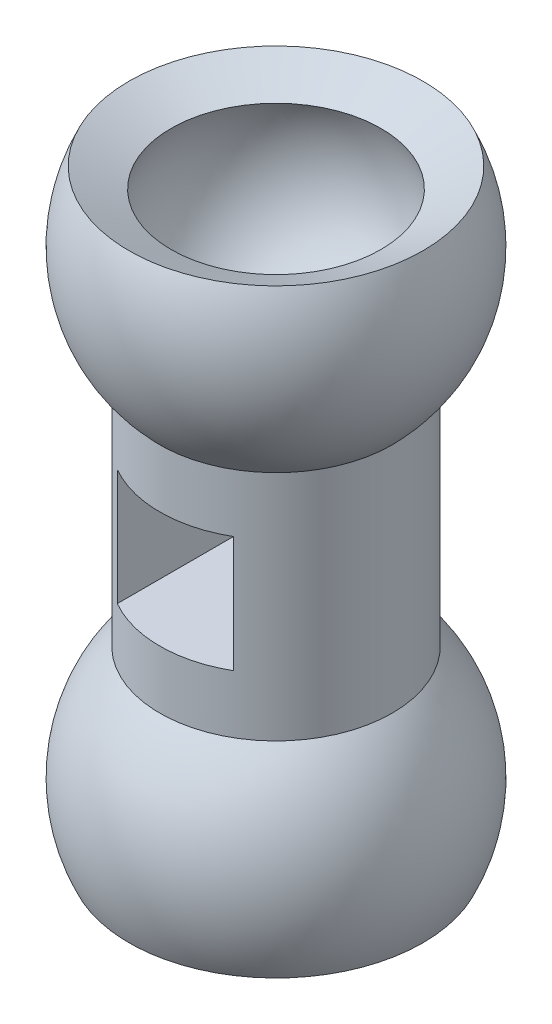
ISO-10303-21;
HEADER;
FILE_DESCRIPTION(('STEP AP214'),'2;1');
FILE_NAME('part.step','',(''),(''),'','','');
FILE_SCHEMA(('AUTOMOTIVE_DESIGN { 1 0 10303 214 1 1 1 1 }'));
ENDSEC;
DATA;
#1=APPLICATION_CONTEXT('core data for automotive mechanical design processes');
#2=APPLICATION_PROTOCOL_DEFINITION('international standard','automotive_design',2000,#1);
#3=PRODUCT_CONTEXT('',#1,'mechanical');
#4=PRODUCT('Part','Part','',(#3));
#5=PRODUCT_RELATED_PRODUCT_CATEGORY('part','',(#4));
#6=PRODUCT_DEFINITION_FORMATION('','',#4);
#7=PRODUCT_DEFINITION_CONTEXT('part definition',#1,'design');
#8=PRODUCT_DEFINITION('design','',#6,#7);
#9=PRODUCT_DEFINITION_SHAPE('','',#8);
#10=(LENGTH_UNIT() NAMED_UNIT(*) SI_UNIT(.MILLI.,.METRE.));
#11=(NAMED_UNIT(*) PLANE_ANGLE_UNIT() SI_UNIT($,.RADIAN.));
#12=(NAMED_UNIT(*) SI_UNIT($,.STERADIAN.) SOLID_ANGLE_UNIT());
#13=UNCERTAINTY_MEASURE_WITH_UNIT(LENGTH_MEASURE(1.E-05),#10,'distance_accuracy_value','');
#14=(GEOMETRIC_REPRESENTATION_CONTEXT(3) GLOBAL_UNCERTAINTY_ASSIGNED_CONTEXT((#13)) GLOBAL_UNIT_ASSIGNED_CONTEXT((#10,
#11,#12)) REPRESENTATION_CONTEXT('',''));
#15=CARTESIAN_POINT('',(0.,0.,0.));
#16=DIRECTION('',(0.,0.,1.));
#17=DIRECTION('',(1.,0.,0.));
#18=AXIS2_PLACEMENT_3D('',#15,#16,#17);
#19=CARTESIAN_POINT('',(0.,12.8629636734559,0.));
#20=DIRECTION('',(0.,1.,0.));
#21=DIRECTION('',(0.,0.,1.));
#22=AXIS2_PLACEMENT_3D('',#19,#20,#21);
#23=CYLINDRICAL_SURFACE('',#22,5.);
#24=DIRECTION('',(0.,1.,0.));
#25=VECTOR('',#24,1.);
#26=CARTESIAN_POINT('',(2.5,12.8629636734559,4.33012701892219));
#27=LINE('',#26,#25);
#28=CARTESIAN_POINT('',(2.5,-7.39897948556636,4.33012701892219));
#29=VERTEX_POINT('',#28);
#30=CARTESIAN_POINT('',(2.5,-12.3989794855664,4.33012701892219));
#31=VERTEX_POINT('',#30);
#32=EDGE_CURVE('E55',#29,#31,#27,.F.);
#33=ORIENTED_EDGE('',*,*,#32,.T.);
#34=CARTESIAN_POINT('',(0.,-12.3989794855664,0.));
#35=DIRECTION('',(0.,1.,0.));
#36=DIRECTION('',(0.,0.,1.));
#37=AXIS2_PLACEMENT_3D('',#34,#35,#36);
#38=CIRCLE('',#37,5.);
#39=CARTESIAN_POINT('',(-2.5,-12.3989794855664,4.3301270189222));
#40=VERTEX_POINT('',#39);
#41=EDGE_CURVE('E43',#40,#31,#38,.T.);
#42=ORIENTED_EDGE('',*,*,#41,.F.);
#43=DIRECTION('',(0.,1.,0.));
#44=VECTOR('',#43,1.);
#45=CARTESIAN_POINT('',(-2.5,12.8629636734559,4.3301270189222));
#46=LINE('',#45,#44);
#47=CARTESIAN_POINT('',(-2.5,-7.39897948556636,4.3301270189222));
#48=VERTEX_POINT('',#47);
#49=EDGE_CURVE('E87',#40,#48,#46,.T.);
#50=ORIENTED_EDGE('',*,*,#49,.T.);
#51=CARTESIAN_POINT('',(0.,-7.39897948556636,0.));
#52=DIRECTION('',(0.,1.,0.));
#53=DIRECTION('',(0.,0.,1.));
#54=AXIS2_PLACEMENT_3D('',#51,#52,#53);
#55=CIRCLE('',#54,5.);
#56=EDGE_CURVE('E140',#48,#29,#55,.T.);
#57=ORIENTED_EDGE('',*,*,#56,.T.);
#58=EDGE_LOOP('',(#33,#42,#50,#57));
#59=FACE_BOUND('',#58,.T.);
#60=CARTESIAN_POINT('',(0.,-4.89897948556636,0.));
#61=DIRECTION('',(0.,1.,0.));
#62=DIRECTION('',(0.,0.,1.));
#63=AXIS2_PLACEMENT_3D('',#60,#61,#62);
#64=CIRCLE('',#63,5.);
#65=CARTESIAN_POINT('',(5.,-4.89897948556636,0.));
#66=VERTEX_POINT('',#65);
#67=EDGE_CURVE('E137',#66,#66,#64,.T.);
#68=ORIENTED_EDGE('',*,*,#67,.F.);
#69=EDGE_LOOP('',(#68));
#70=FACE_BOUND('',#69,.T.);
#71=CARTESIAN_POINT('',(0.,-14.8989794855664,0.));
#72=DIRECTION('',(0.,1.,0.));
#73=DIRECTION('',(0.,0.,1.));
#74=AXIS2_PLACEMENT_3D('',#71,#72,#73);
#75=CIRCLE('',#74,5.);
#76=CARTESIAN_POINT('',(5.,-14.8989794855664,0.));
#77=VERTEX_POINT('',#76);
#78=EDGE_CURVE('E113',#77,#77,#75,.T.);
#79=ORIENTED_EDGE('',*,*,#78,.T.);
#80=EDGE_LOOP('',(#79));
#81=FACE_BOUND('',#80,.T.);
#82=CARTESIAN_POINT('',(2.5,-12.3989794855664,-4.33012701892219));
#83=VERTEX_POINT('',#82);
#84=CARTESIAN_POINT('',(-2.5,-12.3989794855664,-4.3301270189222));
#85=VERTEX_POINT('',#84);
#86=EDGE_CURVE('E11',#83,#85,#38,.T.);
#87=ORIENTED_EDGE('',*,*,#86,.F.);
#88=DIRECTION('',(0.,1.,0.));
#89=VECTOR('',#88,1.);
#90=CARTESIAN_POINT('',(2.5,12.8629636734559,-4.33012701892219));
#91=LINE('',#90,#89);
#92=CARTESIAN_POINT('',(2.5,-7.39897948556636,-4.33012701892219));
#93=VERTEX_POINT('',#92);
#94=EDGE_CURVE('E126',#83,#93,#91,.T.);
#95=ORIENTED_EDGE('',*,*,#94,.T.);
#96=CARTESIAN_POINT('',(-2.5,-7.39897948556636,-4.3301270189222));
#97=VERTEX_POINT('',#96);
#98=EDGE_CURVE('E62',#93,#97,#55,.T.);
#99=ORIENTED_EDGE('',*,*,#98,.T.);
#100=DIRECTION('',(0.,1.,0.));
#101=VECTOR('',#100,1.);
#102=CARTESIAN_POINT('',(-2.5,12.8629636734559,-4.3301270189222));
#103=LINE('',#102,#101);
#104=EDGE_CURVE('E81',#97,#85,#103,.F.);
#105=ORIENTED_EDGE('',*,*,#104,.T.);
#106=EDGE_LOOP('',(#87,#95,#99,#105));
#107=FACE_BOUND('',#106,.T.);
#108=ADVANCED_FACE('F39',(#59,#70,#81,#107),#23,.T.);
#109=CARTESIAN_POINT('',(0.,0.,0.));
#110=DIRECTION('',(0.,1.,0.));
#111=DIRECTION('',(1.,0.,0.));
#112=AXIS2_PLACEMENT_3D('',#109,#110,#111);
#113=SPHERICAL_SURFACE('',#112,7.);
#114=CARTESIAN_POINT('',(0.,3.,0.));
#115=DIRECTION('',(0.,1.,0.));
#116=DIRECTION('',(0.,0.,1.));
#117=AXIS2_PLACEMENT_3D('',#114,#115,#116);
#118=CIRCLE('',#117,6.32455532033676);
#119=CARTESIAN_POINT('',(6.32455532033676,3.,0.));
#120=VERTEX_POINT('',#119);
#121=EDGE_CURVE('E129',#120,#120,#118,.T.);
#122=CARTESIAN_POINT('',(6.32455532033676,3.,0.));
#123=CARTESIAN_POINT('',(6.36262189149789,2.91975067269233,0.));
#124=CARTESIAN_POINT('',(6.39915949519675,2.83877615661423,0.));
#125=CARTESIAN_POINT('',(6.46912738158321,2.67549558649861,0.));
#126=CARTESIAN_POINT('',(6.50255766427082,2.59318953246109,0.));
#127=CARTESIAN_POINT('',(6.56626152254812,2.4273647260081,0.));
#128=CARTESIAN_POINT('',(6.59653509813781,2.34384597359262,0.));
#129=CARTESIAN_POINT('',(6.65388193595587,2.17571688387491,0.));
#130=CARTESIAN_POINT('',(6.68095519818424,2.09110654657269,0.));
#131=CARTESIAN_POINT('',(6.73186211649079,1.92091684358267,0.));
#132=CARTESIAN_POINT('',(6.75569577256897,1.83533747789489,0.));
#133=CARTESIAN_POINT('',(6.8000889660247,1.6633337157029,0.));
#134=CARTESIAN_POINT('',(6.82064850340225,1.57690931919869,0.));
#135=CARTESIAN_POINT('',(6.85846366733238,1.40334070730235,0.));
#136=CARTESIAN_POINT('',(6.87571929388496,1.31619649191022,0.));
#137=CARTESIAN_POINT('',(6.90690163705539,1.14131449972439,0.));
#138=CARTESIAN_POINT('',(6.92082835367324,1.0535767229307,0.));
#139=CARTESIAN_POINT('',(6.94533269921408,0.877634724682152,0.));
#140=CARTESIAN_POINT('',(6.95591032813706,0.789430503227302,0.));
#141=CARTESIAN_POINT('',(6.97370117322436,0.612683408385937,0.));
#142=CARTESIAN_POINT('',(6.98091438938868,0.524140534999422,0.));
#143=CARTESIAN_POINT('',(6.99196595822844,0.346844419621143,0.));
#144=CARTESIAN_POINT('',(6.99580431090388,0.258091177629379,0.));
#145=CARTESIAN_POINT('',(7.00010059166232,0.0805029131685425,0.));
#146=CARTESIAN_POINT('',(7.00055851974531,-0.00833210930052961,0.));
#147=CARTESIAN_POINT('',(6.99809328785829,-0.185955228105929,0.));
#148=CARTESIAN_POINT('',(6.99517012788827,-0.274743324442255,0.));
#149=CARTESIAN_POINT('',(6.98594695504986,-0.452143952358989,0.));
#150=CARTESIAN_POINT('',(6.97964694218146,-0.540756483939396,0.));
#151=CARTESIAN_POINT('',(6.96367919117714,-0.7176775980844,0.));
#152=CARTESIAN_POINT('',(6.95401145304122,-0.805986180648998,0.));
#153=CARTESIAN_POINT('',(6.93132225838539,-0.982171452872073,0.));
#154=CARTESIAN_POINT('',(6.91830080186548,-1.07004814253055,0.));
#155=CARTESIAN_POINT('',(6.88892303628409,-1.24524231078935,0.));
#156=CARTESIAN_POINT('',(6.87256672722261,-1.33255978938967,0.));
#157=CARTESIAN_POINT('',(6.83654295402613,-1.50650902758041,0.));
#158=CARTESIAN_POINT('',(6.81687548989113,-1.59314078717083,0.));
#159=CARTESIAN_POINT('',(6.77425790130766,-1.76559307287843,0.));
#160=CARTESIAN_POINT('',(6.75130777685919,-1.85141359899561,0.));
#161=CARTESIAN_POINT('',(6.70215811841704,-2.02211907863079,0.));
#162=CARTESIAN_POINT('',(6.67595858442335,-2.1070040321488,0.));
#163=CARTESIAN_POINT('',(6.62034806549198,-2.27571538294238,0.));
#164=CARTESIAN_POINT('',(6.5909370805543,-2.35954178021797,0.));
#165=CARTESIAN_POINT('',(6.52894627117596,-2.52601456855044,0.));
#166=CARTESIAN_POINT('',(6.4963664467353,-2.60866095960731,0.));
#167=CARTESIAN_POINT('',(6.42808516088652,-2.77265399514506,0.));
#168=CARTESIAN_POINT('',(6.39238369947839,-2.85400063962593,0.));
#169=CARTESIAN_POINT('',(6.317910864969,-3.01527632478622,0.));
#170=CARTESIAN_POINT('',(6.27913949186773,-3.09520536546563,0.));
#171=CARTESIAN_POINT('',(6.1985830069221,-3.25353003957323,0.));
#172=CARTESIAN_POINT('',(6.15679789507773,-3.33192567300142,0.));
#173=CARTESIAN_POINT('',(6.07027447234267,-3.48706995112567,0.));
#174=CARTESIAN_POINT('',(6.02553616145198,-3.56381859582173,0.));
#175=CARTESIAN_POINT('',(5.93317115765453,-3.71555769998469,0.));
#176=CARTESIAN_POINT('',(5.88554446474775,-3.79054815945161,0.));
#177=CARTESIAN_POINT('',(5.78747170372412,-3.93866224851338,0.));
#178=CARTESIAN_POINT('',(5.73702563560726,-4.01178587810823,0.));
#179=CARTESIAN_POINT('',(5.63338719706399,-4.15606035052665,0.));
#180=CARTESIAN_POINT('',(5.58019482663759,-4.22721119335021,0.));
#181=CARTESIAN_POINT('',(5.47114090505833,-4.36743705688907,0.));
#182=CARTESIAN_POINT('',(5.41527935390547,-4.43651207760437,0.));
#183=CARTESIAN_POINT('',(5.30096779927336,-4.57248603272879,0.));
#184=CARTESIAN_POINT('',(5.24251779579411,-4.63938496713791,0.));
#185=CARTESIAN_POINT('',(5.12311478682553,-4.77091052036587,0.));
#186=CARTESIAN_POINT('',(5.0621617813362,-4.83553713918471,0.));
#187=CARTESIAN_POINT('',(5.,-4.89897948556636,0.));
#188=B_SPLINE_CURVE_WITH_KNOTS('',3,(#122,#123,#124,#125,#126,#127,#128,#129,#130,#131,#132,
#133,#134,#135,#136,#137,#138,#139,#140,#141,#142,#143,#144,#145,#146,#147,#148,#149,#150,#151,
#152,#153,#154,#155,#156,#157,#158,#159,#160,#161,#162,#163,#164,#165,#166,#167,#168,#169,#170,
#171,#172,#173,#174,#175,#176,#177,#178,#179,#180,#181,#182,#183,#184,#185,#186,#187),
.UNSPECIFIED.,.F.,.F.,(4,2,2,2,2,2,2,2,2,2,2,2,2,2,2,2,2,2,2,2,2,2,2,2,2,2,2,2,2,2,2,2,4),(0.,
0.266444254025314,0.532888508050627,0.799332762075942,1.06577701610126,1.33222127012657,
1.59866552415188,1.8651097781772,2.13155403220251,2.39799828622782,2.66444254025314,
2.93088679427845,3.19733104830377,3.46377530232908,3.73021955635439,3.99666381037971,
4.26310806440502,4.52955231843034,4.79599657245565,5.06244082648096,5.32888508050628,
5.59532933453159,5.8617735885569,6.12821784258222,6.39466209660753,6.66110635063285,
6.92755060465816,7.19399485868347,7.46043911270879,7.7268833667341,7.99332762075941,
8.25977187478473,8.52621612881004),.UNSPECIFIED.);
#189=EDGE_CURVE('BSEAM41',#120,#66,#188,.T.);
#190=ORIENTED_EDGE('',*,*,#121,.F.);
#191=ORIENTED_EDGE('',*,*,#67,.T.);
#192=ORIENTED_EDGE('',*,*,#189,.T.);
#193=ORIENTED_EDGE('',*,*,#189,.F.);
#194=EDGE_LOOP('',(#190,#192,#191,#193));
#195=FACE_BOUND('',#194,.T.);
#196=ADVANCED_FACE('F41',(#195),#113,.T.);
#197=CARTESIAN_POINT('',(0.,0.,0.));
#198=DIRECTION('',(0.,1.,0.));
#199=DIRECTION('',(1.,0.,0.));
#200=AXIS2_PLACEMENT_3D('',#197,#198,#199);
#201=SPHERICAL_SURFACE('',#200,5.);
#202=CARTESIAN_POINT('',(0.,2.14285714285714,0.));
#203=DIRECTION('',(0.,1.,0.));
#204=DIRECTION('',(0.,0.,1.));
#205=AXIS2_PLACEMENT_3D('',#202,#203,#204);
#206=CIRCLE('',#205,4.51753951452626);
#207=CARTESIAN_POINT('',(0.,2.14285714285714,4.51753951452626));
#208=VERTEX_POINT('',#207);
#209=EDGE_CURVE('E133',#208,#208,#206,.T.);
#210=ORIENTED_EDGE('',*,*,#209,.T.);
#211=EDGE_LOOP('',(#210));
#212=FACE_BOUND('',#211,.T.);
#213=ADVANCED_FACE('F176',(#212),#201,.F.);
#214=CARTESIAN_POINT('',(0.,3.,0.));
#215=DIRECTION('',(0.,1.,0.));
#216=DIRECTION('',(0.,0.,1.));
#217=AXIS2_PLACEMENT_3D('',#214,#215,#216);
#218=CONICAL_SURFACE('',#217,6.32455532033676,1.12788528272126);
#219=ORIENTED_EDGE('',*,*,#209,.F.);
#220=EDGE_LOOP('',(#219));
#221=FACE_BOUND('',#220,.T.);
#222=ORIENTED_EDGE('',*,*,#121,.T.);
#223=EDGE_LOOP('',(#222));
#224=FACE_BOUND('',#223,.T.);
#225=ADVANCED_FACE('F171',(#221,#224),#218,.F.);
#226=CARTESIAN_POINT('',(-2.5,-7.39897948556636,-7.));
#227=DIRECTION('',(0.,1.,0.));
#228=DIRECTION('',(0.,0.,1.));
#229=AXIS2_PLACEMENT_3D('',#226,#227,#228);
#230=PLANE('',#229);
#231=DIRECTION('',(0.,0.,1.));
#232=VECTOR('',#231,1.);
#233=CARTESIAN_POINT('',(2.5,-7.39897948556636,-7.));
#234=LINE('',#233,#232);
#235=EDGE_CURVE('E117',#93,#29,#234,.T.);
#236=ORIENTED_EDGE('',*,*,#235,.T.);
#237=ORIENTED_EDGE('',*,*,#56,.F.);
#238=DIRECTION('',(0.,0.,1.));
#239=VECTOR('',#238,1.);
#240=CARTESIAN_POINT('',(-2.5,-7.39897948556636,-7.));
#241=LINE('',#240,#239);
#242=EDGE_CURVE('E88',#97,#48,#241,.T.);
#243=ORIENTED_EDGE('',*,*,#242,.F.);
#244=ORIENTED_EDGE('',*,*,#98,.F.);
#245=EDGE_LOOP('',(#236,#237,#243,#244));
#246=FACE_BOUND('',#245,.T.);
#247=ADVANCED_FACE('F147',(#246),#230,.F.);
#248=CARTESIAN_POINT('',(2.5,-7.39897948556636,-7.));
#249=DIRECTION('',(1.,0.,0.));
#250=DIRECTION('',(0.,0.,-1.));
#251=AXIS2_PLACEMENT_3D('',#248,#249,#250);
#252=PLANE('',#251);
#253=ORIENTED_EDGE('',*,*,#94,.F.);
#254=DIRECTION('',(0.,0.,1.));
#255=VECTOR('',#254,1.);
#256=CARTESIAN_POINT('',(2.5,-12.3989794855664,-7.));
#257=LINE('',#256,#255);
#258=EDGE_CURVE('E97',#83,#31,#257,.T.);
#259=ORIENTED_EDGE('',*,*,#258,.T.);
#260=ORIENTED_EDGE('',*,*,#32,.F.);
#261=ORIENTED_EDGE('',*,*,#235,.F.);
#262=EDGE_LOOP('',(#253,#259,#260,#261));
#263=FACE_BOUND('',#262,.T.);
#264=ADVANCED_FACE('F146',(#263),#252,.F.);
#265=CARTESIAN_POINT('',(-2.5,-7.39897948556636,-7.));
#266=DIRECTION('',(-1.,0.,0.));
#267=DIRECTION('',(0.,0.,1.));
#268=AXIS2_PLACEMENT_3D('',#265,#266,#267);
#269=PLANE('',#268);
#270=ORIENTED_EDGE('',*,*,#49,.F.);
#271=DIRECTION('',(0.,0.,1.));
#272=VECTOR('',#271,1.);
#273=CARTESIAN_POINT('',(-2.5,-12.3989794855664,-7.));
#274=LINE('',#273,#272);
#275=EDGE_CURVE('E95',#85,#40,#274,.T.);
#276=ORIENTED_EDGE('',*,*,#275,.F.);
#277=ORIENTED_EDGE('',*,*,#104,.F.);
#278=ORIENTED_EDGE('',*,*,#242,.T.);
#279=EDGE_LOOP('',(#270,#276,#277,#278));
#280=FACE_BOUND('',#279,.T.);
#281=ADVANCED_FACE('F98',(#280),#269,.F.);
#282=CARTESIAN_POINT('',(0.,-19.7979589711327,0.));
#283=DIRECTION('',(0.,-1.,0.));
#284=DIRECTION('',(1.,0.,0.));
#285=AXIS2_PLACEMENT_3D('',#282,#283,#284);
#286=SPHERICAL_SURFACE('',#285,7.);
#287=CARTESIAN_POINT('',(0.,-22.7979589711327,0.));
#288=DIRECTION('',(0.,1.,0.));
#289=DIRECTION('',(0.,0.,1.));
#290=AXIS2_PLACEMENT_3D('',#287,#288,#289);
#291=CIRCLE('',#290,6.32455532033676);
#292=CARTESIAN_POINT('',(6.32455532033676,-22.7979589711327,0.));
#293=VERTEX_POINT('',#292);
#294=EDGE_CURVE('E103',#293,#293,#291,.T.);
#295=CARTESIAN_POINT('',(6.32455532033676,-22.7979589711327,0.));
#296=CARTESIAN_POINT('',(6.36262189149789,-22.717709643825,0.));
#297=CARTESIAN_POINT('',(6.39915949519675,-22.6367351277469,0.));
#298=CARTESIAN_POINT('',(6.46912738158321,-22.4734545576313,0.));
#299=CARTESIAN_POINT('',(6.50255766427082,-22.3911485035938,0.));
#300=CARTESIAN_POINT('',(6.56626152254812,-22.2253236971408,0.));
#301=CARTESIAN_POINT('',(6.59653509813781,-22.1418049447253,0.));
#302=CARTESIAN_POINT('',(6.65388193595587,-21.9736758550076,0.));
#303=CARTESIAN_POINT('',(6.68095519818424,-21.8890655177054,0.));
#304=CARTESIAN_POINT('',(6.73186211649079,-21.7188758147154,0.));
#305=CARTESIAN_POINT('',(6.75569577256897,-21.6332964490276,0.));
#306=CARTESIAN_POINT('',(6.8000889660247,-21.4612926868356,0.));
#307=CARTESIAN_POINT('',(6.82064850340225,-21.3748682903314,0.));
#308=CARTESIAN_POINT('',(6.85846366733238,-21.2012996784351,0.));
#309=CARTESIAN_POINT('',(6.87571929388496,-21.1141554630429,0.));
#310=CARTESIAN_POINT('',(6.90690163705539,-20.9392734708571,0.));
#311=CARTESIAN_POINT('',(6.92082835367324,-20.8515356940634,0.));
#312=CARTESIAN_POINT('',(6.94533269921408,-20.6755936958149,0.));
#313=CARTESIAN_POINT('',(6.95591032813706,-20.58738947436,0.));
#314=CARTESIAN_POINT('',(6.97370117322436,-20.4106423795187,0.));
#315=CARTESIAN_POINT('',(6.98091438938868,-20.3220995061321,0.));
#316=CARTESIAN_POINT('',(6.99196595822844,-20.1448033907539,0.));
#317=CARTESIAN_POINT('',(6.99580431090388,-20.0560501487621,0.));
#318=CARTESIAN_POINT('',(7.00010059166232,-19.8784618843013,0.));
#319=CARTESIAN_POINT('',(7.00055851974531,-19.7896268618322,0.));
#320=CARTESIAN_POINT('',(6.99809328785829,-19.6120037430268,0.));
#321=CARTESIAN_POINT('',(6.99517012788827,-19.5232156466905,0.));
#322=CARTESIAN_POINT('',(6.98594695504986,-19.3458150187737,0.));
#323=CARTESIAN_POINT('',(6.97964694218146,-19.2572024871933,0.));
#324=CARTESIAN_POINT('',(6.96367919117714,-19.0802813730483,0.));
#325=CARTESIAN_POINT('',(6.95401145304122,-18.9919727904837,0.));
#326=CARTESIAN_POINT('',(6.93132225838539,-18.8157875182606,0.));
#327=CARTESIAN_POINT('',(6.91830080186548,-18.7279108286022,0.));
#328=CARTESIAN_POINT('',(6.88892303628409,-18.5527166603434,0.));
#329=CARTESIAN_POINT('',(6.87256672722261,-18.465399181743,0.));
#330=CARTESIAN_POINT('',(6.83654295402613,-18.2914499435523,0.));
#331=CARTESIAN_POINT('',(6.81687548989113,-18.2048181839619,0.));
#332=CARTESIAN_POINT('',(6.77425790130766,-18.0323658982543,0.));
#333=CARTESIAN_POINT('',(6.75130777685919,-17.9465453721371,0.));
#334=CARTESIAN_POINT('',(6.70215811841704,-17.7758398925019,0.));
#335=CARTESIAN_POINT('',(6.67595858442335,-17.6909549389839,0.));
#336=CARTESIAN_POINT('',(6.62034806549199,-17.5222435881903,0.));
#337=CARTESIAN_POINT('',(6.5909370805543,-17.4384171909147,0.));
#338=CARTESIAN_POINT('',(6.52894627117596,-17.2719444025823,0.));
#339=CARTESIAN_POINT('',(6.49636644673531,-17.1892980115254,0.));
#340=CARTESIAN_POINT('',(6.42808516088652,-17.0253049759877,0.));
#341=CARTESIAN_POINT('',(6.39238369947839,-16.9439583315068,0.));
#342=CARTESIAN_POINT('',(6.317910864969,-16.7826826463465,0.));
#343=CARTESIAN_POINT('',(6.27913949186773,-16.7027536056671,0.));
#344=CARTESIAN_POINT('',(6.1985830069221,-16.5444289315595,0.));
#345=CARTESIAN_POINT('',(6.15679789507773,-16.4660332981313,0.));
#346=CARTESIAN_POINT('',(6.07027447234267,-16.310889020007,0.));
#347=CARTESIAN_POINT('',(6.02553616145198,-16.234140375311,0.));
#348=CARTESIAN_POINT('',(5.93317115765453,-16.082401271148,0.));
#349=CARTESIAN_POINT('',(5.88554446474776,-16.0074108116811,0.));
#350=CARTESIAN_POINT('',(5.78747170372412,-15.8592967226193,0.));
#351=CARTESIAN_POINT('',(5.73702563560726,-15.7861730930245,0.));
#352=CARTESIAN_POINT('',(5.63338719706399,-15.6418986206061,0.));
#353=CARTESIAN_POINT('',(5.58019482663759,-15.5707477777825,0.));
#354=CARTESIAN_POINT('',(5.47114090505833,-15.4305219142436,0.));
#355=CARTESIAN_POINT('',(5.41527935390547,-15.3614468935283,0.));
#356=CARTESIAN_POINT('',(5.30096779927336,-15.2254729384039,0.));
#357=CARTESIAN_POINT('',(5.24251779579411,-15.1585740039948,0.));
#358=CARTESIAN_POINT('',(5.12311478682553,-15.0270484507668,0.));
#359=CARTESIAN_POINT('',(5.06216178133621,-14.962421831948,0.));
#360=CARTESIAN_POINT('',(5.,-14.8989794855664,0.));
#361=B_SPLINE_CURVE_WITH_KNOTS('',3,(#295,#296,#297,#298,#299,#300,#301,#302,#303,#304,#305,
#306,#307,#308,#309,#310,#311,#312,#313,#314,#315,#316,#317,#318,#319,#320,#321,#322,#323,#324,
#325,#326,#327,#328,#329,#330,#331,#332,#333,#334,#335,#336,#337,#338,#339,#340,#341,#342,#343,
#344,#345,#346,#347,#348,#349,#350,#351,#352,#353,#354,#355,#356,#357,#358,#359,#360),
.UNSPECIFIED.,.F.,.F.,(4,2,2,2,2,2,2,2,2,2,2,2,2,2,2,2,2,2,2,2,2,2,2,2,2,2,2,2,2,2,2,2,4),(0.,
0.266444254025312,0.532888508050625,0.799332762075941,1.06577701610125,1.33222127012657,
1.59866552415188,1.86510977817719,2.13155403220251,2.39799828622782,2.66444254025314,
2.93088679427845,3.19733104830376,3.46377530232908,3.73021955635439,3.99666381037971,
4.26310806440502,4.52955231843033,4.79599657245565,5.06244082648096,5.32888508050628,
5.59532933453159,5.8617735885569,6.12821784258222,6.39466209660753,6.66110635063284,
6.92755060465816,7.19399485868347,7.46043911270878,7.7268833667341,7.99332762075941,
8.25977187478473,8.52621612881004),.UNSPECIFIED.);
#362=EDGE_CURVE('BSEAM154',#293,#77,#361,.T.);
#363=ORIENTED_EDGE('',*,*,#294,.T.);
#364=ORIENTED_EDGE('',*,*,#78,.F.);
#365=ORIENTED_EDGE('',*,*,#362,.T.);
#366=ORIENTED_EDGE('',*,*,#362,.F.);
#367=EDGE_LOOP('',(#363,#365,#364,#366));
#368=FACE_BOUND('',#367,.T.);
#369=ADVANCED_FACE('F154',(#368),#286,.T.);
#370=CARTESIAN_POINT('',(0.,-19.7979589711327,0.));
#371=DIRECTION('',(0.,-1.,0.));
#372=DIRECTION('',(1.,0.,0.));
#373=AXIS2_PLACEMENT_3D('',#370,#371,#372);
#374=SPHERICAL_SURFACE('',#373,5.);
#375=CARTESIAN_POINT('',(0.,-21.9408161139899,0.));
#376=DIRECTION('',(0.,1.,0.));
#377=DIRECTION('',(0.,0.,1.));
#378=AXIS2_PLACEMENT_3D('',#375,#376,#377);
#379=CIRCLE('',#378,4.51753951452626);
#380=CARTESIAN_POINT('',(0.,-21.9408161139899,4.51753951452626));
#381=VERTEX_POINT('',#380);
#382=EDGE_CURVE('E109',#381,#381,#379,.T.);
#383=ORIENTED_EDGE('',*,*,#382,.F.);
#384=EDGE_LOOP('',(#383));
#385=FACE_BOUND('',#384,.T.);
#386=ADVANCED_FACE('F156',(#385),#374,.F.);
#387=CARTESIAN_POINT('',(0.,-22.7979589711327,0.));
#388=DIRECTION('',(0.,-1.,0.));
#389=DIRECTION('',(0.,0.,1.));
#390=AXIS2_PLACEMENT_3D('',#387,#388,#389);
#391=CONICAL_SURFACE('',#390,6.32455532033676,1.12788528272126);
#392=ORIENTED_EDGE('',*,*,#382,.T.);
#393=EDGE_LOOP('',(#392));
#394=FACE_BOUND('',#393,.T.);
#395=ORIENTED_EDGE('',*,*,#294,.F.);
#396=EDGE_LOOP('',(#395));
#397=FACE_BOUND('',#396,.T.);
#398=ADVANCED_FACE('F163',(#394,#397),#391,.F.);
#399=CARTESIAN_POINT('',(-2.5,-12.3989794855664,-7.));
#400=DIRECTION('',(0.,1.,0.));
#401=DIRECTION('',(0.,0.,1.));
#402=AXIS2_PLACEMENT_3D('',#399,#400,#401);
#403=PLANE('',#402);
#404=ORIENTED_EDGE('',*,*,#86,.T.);
#405=ORIENTED_EDGE('',*,*,#275,.T.);
#406=ORIENTED_EDGE('',*,*,#41,.T.);
#407=ORIENTED_EDGE('',*,*,#258,.F.);
#408=EDGE_LOOP('',(#404,#405,#406,#407));
#409=FACE_BOUND('',#408,.T.);
#410=ADVANCED_FACE('F93',(#409),#403,.T.);
#411=CLOSED_SHELL('',(#108,#196,#213,#225,#247,#264,#281,#369,#386,#398,#410));
#412=MANIFOLD_SOLID_BREP('B2',#411);
#413=ADVANCED_BREP_SHAPE_REPRESENTATION('',(#18,#412),#14);
#414=SHAPE_DEFINITION_REPRESENTATION(#9,#413);
ENDSEC;
END-ISO-10303-21;
